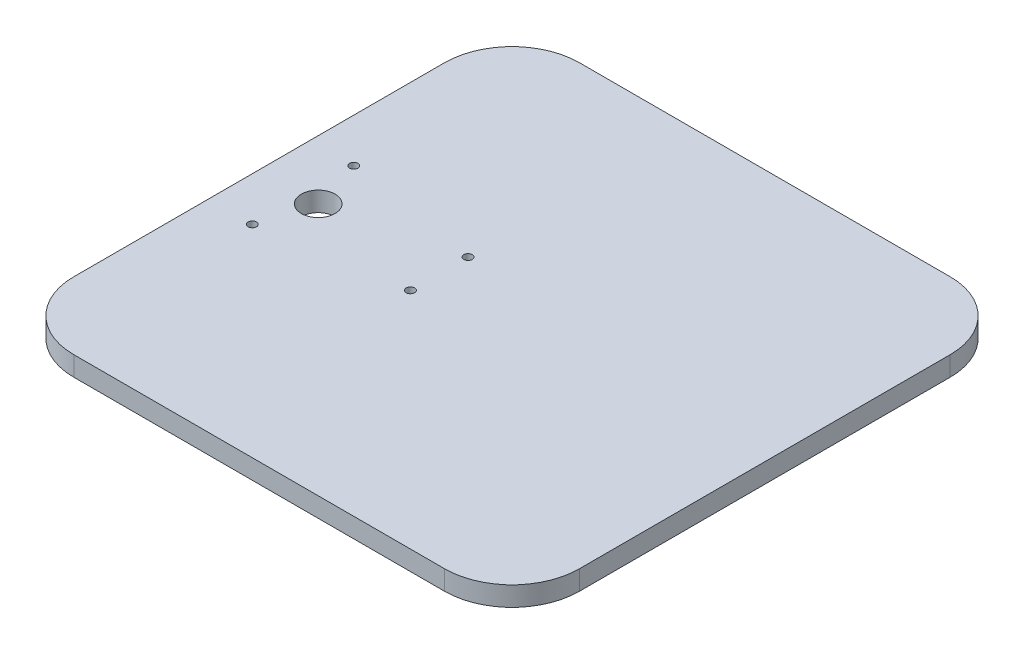
ISO-10303-21;
HEADER;
FILE_DESCRIPTION(('STEP AP214'),'2;1');
FILE_NAME('part.step','',(''),(''),'','','');
FILE_SCHEMA(('AUTOMOTIVE_DESIGN { 1 0 10303 214 1 1 1 1 }'));
ENDSEC;
DATA;
#1=APPLICATION_CONTEXT('core data for automotive mechanical design processes');
#2=APPLICATION_PROTOCOL_DEFINITION('international standard','automotive_design',2000,#1);
#3=PRODUCT_CONTEXT('',#1,'mechanical');
#4=PRODUCT('Part','Part','',(#3));
#5=PRODUCT_RELATED_PRODUCT_CATEGORY('part','',(#4));
#6=PRODUCT_DEFINITION_FORMATION('','',#4);
#7=PRODUCT_DEFINITION_CONTEXT('part definition',#1,'design');
#8=PRODUCT_DEFINITION('design','',#6,#7);
#9=PRODUCT_DEFINITION_SHAPE('','',#8);
#10=(LENGTH_UNIT() NAMED_UNIT(*) SI_UNIT(.MILLI.,.METRE.));
#11=(NAMED_UNIT(*) PLANE_ANGLE_UNIT() SI_UNIT($,.RADIAN.));
#12=(NAMED_UNIT(*) SI_UNIT($,.STERADIAN.) SOLID_ANGLE_UNIT());
#13=UNCERTAINTY_MEASURE_WITH_UNIT(LENGTH_MEASURE(1.E-05),#10,'distance_accuracy_value','');
#14=(GEOMETRIC_REPRESENTATION_CONTEXT(3) GLOBAL_UNCERTAINTY_ASSIGNED_CONTEXT((#13)) GLOBAL_UNIT_ASSIGNED_CONTEXT((#10,
#11,#12)) REPRESENTATION_CONTEXT('',''));
#15=CARTESIAN_POINT('',(0.,0.,0.));
#16=DIRECTION('',(0.,0.,1.));
#17=DIRECTION('',(1.,0.,0.));
#18=AXIS2_PLACEMENT_3D('',#15,#16,#17);
#19=CARTESIAN_POINT('',(-61.9857466338404,0.,-15.05));
#20=DIRECTION('',(0.,1.,0.));
#21=DIRECTION('',(0.,0.,1.));
#22=AXIS2_PLACEMENT_3D('',#19,#20,#21);
#23=CYLINDRICAL_SURFACE('',#22,1.25);
#24=CARTESIAN_POINT('',(-61.9857466338404,5.8,-15.05));
#25=DIRECTION('',(0.,1.,0.));
#26=DIRECTION('',(0.,0.,1.));
#27=AXIS2_PLACEMENT_3D('',#24,#25,#26);
#28=CIRCLE('',#27,1.25);
#29=CARTESIAN_POINT('',(-61.9857466338404,5.8,-13.8));
#30=VERTEX_POINT('',#29);
#31=EDGE_CURVE('E201',#30,#30,#28,.T.);
#32=ORIENTED_EDGE('',*,*,#31,.T.);
#33=EDGE_LOOP('',(#32));
#34=FACE_BOUND('',#33,.T.);
#35=CARTESIAN_POINT('',(-61.9857466338404,3.5,-15.05));
#36=DIRECTION('',(0.,-1.,0.));
#37=DIRECTION('',(0.,0.,-1.));
#38=AXIS2_PLACEMENT_3D('',#35,#36,#37);
#39=CIRCLE('',#38,1.25);
#40=CARTESIAN_POINT('',(-61.9857466338404,3.5,-16.3));
#41=VERTEX_POINT('',#40);
#42=EDGE_CURVE('E42',#41,#41,#39,.F.);
#43=ORIENTED_EDGE('',*,*,#42,.F.);
#44=EDGE_LOOP('',(#43));
#45=FACE_BOUND('',#44,.T.);
#46=ADVANCED_FACE('F38',(#34,#45),#23,.F.);
#47=CARTESIAN_POINT('',(-21.5857466338404,0.,8.55));
#48=DIRECTION('',(0.,1.,0.));
#49=DIRECTION('',(0.,0.,1.));
#50=AXIS2_PLACEMENT_3D('',#47,#48,#49);
#51=CYLINDRICAL_SURFACE('',#50,1.25);
#52=CARTESIAN_POINT('',(-21.5857466338404,5.8,8.55));
#53=DIRECTION('',(0.,1.,0.));
#54=DIRECTION('',(0.,0.,1.));
#55=AXIS2_PLACEMENT_3D('',#52,#53,#54);
#56=CIRCLE('',#55,1.25);
#57=CARTESIAN_POINT('',(-21.5857466338404,5.8,9.8));
#58=VERTEX_POINT('',#57);
#59=EDGE_CURVE('E207',#58,#58,#56,.T.);
#60=ORIENTED_EDGE('',*,*,#59,.T.);
#61=EDGE_LOOP('',(#60));
#62=FACE_BOUND('',#61,.T.);
#63=CARTESIAN_POINT('',(-21.5857466338404,3.5,8.55));
#64=DIRECTION('',(0.,-1.,0.));
#65=DIRECTION('',(0.,0.,-1.));
#66=AXIS2_PLACEMENT_3D('',#63,#64,#65);
#67=CIRCLE('',#66,1.25);
#68=CARTESIAN_POINT('',(-21.5857466338404,3.5,7.3));
#69=VERTEX_POINT('',#68);
#70=EDGE_CURVE('E189',#69,#69,#67,.F.);
#71=ORIENTED_EDGE('',*,*,#70,.F.);
#72=EDGE_LOOP('',(#71));
#73=FACE_BOUND('',#72,.T.);
#74=ADVANCED_FACE('F261',(#62,#73),#51,.F.);
#75=CARTESIAN_POINT('',(-21.5857466338404,0.,-8.55));
#76=DIRECTION('',(0.,1.,0.));
#77=DIRECTION('',(0.,0.,1.));
#78=AXIS2_PLACEMENT_3D('',#75,#76,#77);
#79=CYLINDRICAL_SURFACE('',#78,1.25);
#80=CARTESIAN_POINT('',(-21.5857466338404,5.8,-8.55));
#81=DIRECTION('',(0.,1.,0.));
#82=DIRECTION('',(0.,0.,1.));
#83=AXIS2_PLACEMENT_3D('',#80,#81,#82);
#84=CIRCLE('',#83,1.25);
#85=CARTESIAN_POINT('',(-21.5857466338404,5.8,-7.3));
#86=VERTEX_POINT('',#85);
#87=EDGE_CURVE('E216',#86,#86,#84,.T.);
#88=ORIENTED_EDGE('',*,*,#87,.T.);
#89=EDGE_LOOP('',(#88));
#90=FACE_BOUND('',#89,.T.);
#91=CARTESIAN_POINT('',(-21.5857466338404,3.5,-8.55));
#92=DIRECTION('',(0.,-1.,0.));
#93=DIRECTION('',(0.,0.,-1.));
#94=AXIS2_PLACEMENT_3D('',#91,#92,#93);
#95=CIRCLE('',#94,1.25);
#96=CARTESIAN_POINT('',(-21.5857466338404,3.5,-9.8));
#97=VERTEX_POINT('',#96);
#98=EDGE_CURVE('E185',#97,#97,#95,.F.);
#99=ORIENTED_EDGE('',*,*,#98,.F.);
#100=EDGE_LOOP('',(#99));
#101=FACE_BOUND('',#100,.T.);
#102=ADVANCED_FACE('F267',(#90,#101),#79,.F.);
#103=CARTESIAN_POINT('',(-61.9857466338404,0.,15.05));
#104=DIRECTION('',(0.,1.,0.));
#105=DIRECTION('',(0.,0.,1.));
#106=AXIS2_PLACEMENT_3D('',#103,#104,#105);
#107=CYLINDRICAL_SURFACE('',#106,1.25);
#108=CARTESIAN_POINT('',(-61.9857466338404,5.8,15.05));
#109=DIRECTION('',(0.,1.,0.));
#110=DIRECTION('',(0.,0.,1.));
#111=AXIS2_PLACEMENT_3D('',#108,#109,#110);
#112=CIRCLE('',#111,1.25);
#113=CARTESIAN_POINT('',(-61.9857466338404,5.8,16.3));
#114=VERTEX_POINT('',#113);
#115=EDGE_CURVE('E224',#114,#114,#112,.T.);
#116=ORIENTED_EDGE('',*,*,#115,.T.);
#117=EDGE_LOOP('',(#116));
#118=FACE_BOUND('',#117,.T.);
#119=CARTESIAN_POINT('',(-61.9857466338404,3.5,15.05));
#120=DIRECTION('',(0.,-1.,0.));
#121=DIRECTION('',(0.,0.,-1.));
#122=AXIS2_PLACEMENT_3D('',#119,#120,#121);
#123=CIRCLE('',#122,1.25);
#124=CARTESIAN_POINT('',(-61.9857466338404,3.5,13.8));
#125=VERTEX_POINT('',#124);
#126=EDGE_CURVE('E181',#125,#125,#123,.F.);
#127=ORIENTED_EDGE('',*,*,#126,.F.);
#128=EDGE_LOOP('',(#127));
#129=FACE_BOUND('',#128,.T.);
#130=ADVANCED_FACE('F359',(#118,#129),#107,.F.);
#131=CARTESIAN_POINT('',(-75.,5.8,75.));
#132=DIRECTION('',(1.,0.,0.));
#133=DIRECTION('',(0.,0.,-1.));
#134=AXIS2_PLACEMENT_3D('',#131,#132,#133);
#135=PLANE('',#134);
#136=DIRECTION('',(0.,0.,1.));
#137=VECTOR('',#136,1.);
#138=CARTESIAN_POINT('',(-75.,0.,75.));
#139=LINE('',#138,#137);
#140=CARTESIAN_POINT('',(-75.,0.,-55.));
#141=VERTEX_POINT('',#140);
#142=CARTESIAN_POINT('',(-75.,0.,55.));
#143=VERTEX_POINT('',#142);
#144=EDGE_CURVE('E227',#141,#143,#139,.T.);
#145=ORIENTED_EDGE('',*,*,#144,.T.);
#146=DIRECTION('',(0.,-1.,0.));
#147=VECTOR('',#146,1.);
#148=CARTESIAN_POINT('',(-75.,5.8,55.));
#149=LINE('',#148,#147);
#150=CARTESIAN_POINT('',(-75.,5.8,55.));
#151=VERTEX_POINT('',#150);
#152=EDGE_CURVE('E11',#143,#151,#149,.F.);
#153=ORIENTED_EDGE('',*,*,#152,.T.);
#154=DIRECTION('',(0.,0.,1.));
#155=VECTOR('',#154,1.);
#156=CARTESIAN_POINT('',(-75.,5.8,75.));
#157=LINE('',#156,#155);
#158=CARTESIAN_POINT('',(-75.,5.8,-55.));
#159=VERTEX_POINT('',#158);
#160=EDGE_CURVE('E136',#159,#151,#157,.T.);
#161=ORIENTED_EDGE('',*,*,#160,.F.);
#162=DIRECTION('',(0.,-1.,0.));
#163=VECTOR('',#162,1.);
#164=CARTESIAN_POINT('',(-75.,5.8,-55.));
#165=LINE('',#164,#163);
#166=EDGE_CURVE('E48',#159,#141,#165,.T.);
#167=ORIENTED_EDGE('',*,*,#166,.T.);
#168=EDGE_LOOP('',(#145,#153,#161,#167));
#169=FACE_BOUND('',#168,.T.);
#170=ADVANCED_FACE('F258',(#169),#135,.F.);
#171=CARTESIAN_POINT('',(75.,5.8,75.));
#172=DIRECTION('',(0.,0.,-1.));
#173=DIRECTION('',(-1.,0.,0.));
#174=AXIS2_PLACEMENT_3D('',#171,#172,#173);
#175=PLANE('',#174);
#176=DIRECTION('',(1.,0.,0.));
#177=VECTOR('',#176,1.);
#178=CARTESIAN_POINT('',(75.,0.,75.));
#179=LINE('',#178,#177);
#180=CARTESIAN_POINT('',(-55.,0.,75.));
#181=VERTEX_POINT('',#180);
#182=CARTESIAN_POINT('',(55.,0.,75.));
#183=VERTEX_POINT('',#182);
#184=EDGE_CURVE('E143',#181,#183,#179,.T.);
#185=ORIENTED_EDGE('',*,*,#184,.T.);
#186=DIRECTION('',(0.,-1.,0.));
#187=VECTOR('',#186,1.);
#188=CARTESIAN_POINT('',(55.,5.8,75.));
#189=LINE('',#188,#187);
#190=CARTESIAN_POINT('',(55.,5.8,75.));
#191=VERTEX_POINT('',#190);
#192=EDGE_CURVE('E56',#183,#191,#189,.F.);
#193=ORIENTED_EDGE('',*,*,#192,.T.);
#194=DIRECTION('',(1.,0.,0.));
#195=VECTOR('',#194,1.);
#196=CARTESIAN_POINT('',(75.,5.8,75.));
#197=LINE('',#196,#195);
#198=CARTESIAN_POINT('',(-55.,5.8,75.));
#199=VERTEX_POINT('',#198);
#200=EDGE_CURVE('E141',#199,#191,#197,.T.);
#201=ORIENTED_EDGE('',*,*,#200,.F.);
#202=DIRECTION('',(0.,-1.,0.));
#203=VECTOR('',#202,1.);
#204=CARTESIAN_POINT('',(-55.,5.8,75.));
#205=LINE('',#204,#203);
#206=EDGE_CURVE('E172',#199,#181,#205,.T.);
#207=ORIENTED_EDGE('',*,*,#206,.T.);
#208=EDGE_LOOP('',(#185,#193,#201,#207));
#209=FACE_BOUND('',#208,.T.);
#210=ADVANCED_FACE('F241',(#209),#175,.F.);
#211=CARTESIAN_POINT('',(75.,5.8,75.));
#212=DIRECTION('',(-1.,0.,0.));
#213=DIRECTION('',(0.,0.,1.));
#214=AXIS2_PLACEMENT_3D('',#211,#212,#213);
#215=PLANE('',#214);
#216=DIRECTION('',(0.,0.,-1.));
#217=VECTOR('',#216,1.);
#218=CARTESIAN_POINT('',(75.,0.,75.));
#219=LINE('',#218,#217);
#220=CARTESIAN_POINT('',(75.,0.,55.));
#221=VERTEX_POINT('',#220);
#222=CARTESIAN_POINT('',(75.,0.,-55.));
#223=VERTEX_POINT('',#222);
#224=EDGE_CURVE('E137',#221,#223,#219,.T.);
#225=ORIENTED_EDGE('',*,*,#224,.T.);
#226=DIRECTION('',(0.,-1.,0.));
#227=VECTOR('',#226,1.);
#228=CARTESIAN_POINT('',(75.,5.8,-55.));
#229=LINE('',#228,#227);
#230=CARTESIAN_POINT('',(75.,5.8,-55.));
#231=VERTEX_POINT('',#230);
#232=EDGE_CURVE('E112',#223,#231,#229,.F.);
#233=ORIENTED_EDGE('',*,*,#232,.T.);
#234=DIRECTION('',(0.,0.,-1.));
#235=VECTOR('',#234,1.);
#236=CARTESIAN_POINT('',(75.,5.8,75.));
#237=LINE('',#236,#235);
#238=CARTESIAN_POINT('',(75.,5.8,55.));
#239=VERTEX_POINT('',#238);
#240=EDGE_CURVE('E231',#239,#231,#237,.T.);
#241=ORIENTED_EDGE('',*,*,#240,.F.);
#242=DIRECTION('',(0.,-1.,0.));
#243=VECTOR('',#242,1.);
#244=CARTESIAN_POINT('',(75.,5.8,55.));
#245=LINE('',#244,#243);
#246=EDGE_CURVE('E118',#239,#221,#245,.T.);
#247=ORIENTED_EDGE('',*,*,#246,.T.);
#248=EDGE_LOOP('',(#225,#233,#241,#247));
#249=FACE_BOUND('',#248,.T.);
#250=ADVANCED_FACE('F250',(#249),#215,.F.);
#251=CARTESIAN_POINT('',(75.,5.8,-75.));
#252=DIRECTION('',(0.,0.,1.));
#253=DIRECTION('',(1.,0.,0.));
#254=AXIS2_PLACEMENT_3D('',#251,#252,#253);
#255=PLANE('',#254);
#256=DIRECTION('',(-1.,0.,0.));
#257=VECTOR('',#256,1.);
#258=CARTESIAN_POINT('',(75.,5.8,-75.));
#259=LINE('',#258,#257);
#260=CARTESIAN_POINT('',(55.,5.8,-75.));
#261=VERTEX_POINT('',#260);
#262=CARTESIAN_POINT('',(-55.,5.8,-75.));
#263=VERTEX_POINT('',#262);
#264=EDGE_CURVE('E128',#261,#263,#259,.T.);
#265=ORIENTED_EDGE('',*,*,#264,.F.);
#266=DIRECTION('',(0.,-1.,0.));
#267=VECTOR('',#266,1.);
#268=CARTESIAN_POINT('',(55.,5.8,-75.));
#269=LINE('',#268,#267);
#270=CARTESIAN_POINT('',(55.,0.,-75.));
#271=VERTEX_POINT('',#270);
#272=EDGE_CURVE('E111',#261,#271,#269,.T.);
#273=ORIENTED_EDGE('',*,*,#272,.T.);
#274=DIRECTION('',(-1.,0.,0.));
#275=VECTOR('',#274,1.);
#276=CARTESIAN_POINT('',(75.,0.,-75.));
#277=LINE('',#276,#275);
#278=CARTESIAN_POINT('',(-55.,0.,-75.));
#279=VERTEX_POINT('',#278);
#280=EDGE_CURVE('E125',#271,#279,#277,.T.);
#281=ORIENTED_EDGE('',*,*,#280,.T.);
#282=DIRECTION('',(0.,-1.,0.));
#283=VECTOR('',#282,1.);
#284=CARTESIAN_POINT('',(-55.,5.8,-75.));
#285=LINE('',#284,#283);
#286=EDGE_CURVE('E131',#279,#263,#285,.F.);
#287=ORIENTED_EDGE('',*,*,#286,.T.);
#288=EDGE_LOOP('',(#265,#273,#281,#287));
#289=FACE_BOUND('',#288,.T.);
#290=ADVANCED_FACE('F124',(#289),#255,.F.);
#291=CARTESIAN_POINT('',(0.,5.8,0.));
#292=DIRECTION('',(0.,1.,0.));
#293=DIRECTION('',(0.,0.,1.));
#294=AXIS2_PLACEMENT_3D('',#291,#292,#293);
#295=PLANE('',#294);
#296=ORIENTED_EDGE('',*,*,#115,.F.);
#297=EDGE_LOOP('',(#296));
#298=FACE_BOUND('',#297,.T.);
#299=CARTESIAN_POINT('',(-57.4857466338404,5.8,0.));
#300=DIRECTION('',(0.,1.,0.));
#301=DIRECTION('',(0.,0.,1.));
#302=AXIS2_PLACEMENT_3D('',#299,#300,#301);
#303=CIRCLE('',#302,5.);
#304=CARTESIAN_POINT('',(-57.4857466338404,5.8,5.));
#305=VERTEX_POINT('',#304);
#306=EDGE_CURVE('E220',#305,#305,#303,.T.);
#307=ORIENTED_EDGE('',*,*,#306,.F.);
#308=EDGE_LOOP('',(#307));
#309=FACE_BOUND('',#308,.T.);
#310=ORIENTED_EDGE('',*,*,#87,.F.);
#311=EDGE_LOOP('',(#310));
#312=FACE_BOUND('',#311,.T.);
#313=ORIENTED_EDGE('',*,*,#59,.F.);
#314=EDGE_LOOP('',(#313));
#315=FACE_BOUND('',#314,.T.);
#316=ORIENTED_EDGE('',*,*,#31,.F.);
#317=EDGE_LOOP('',(#316));
#318=FACE_BOUND('',#317,.T.);
#319=ORIENTED_EDGE('',*,*,#240,.T.);
#320=CARTESIAN_POINT('',(55.,5.8,-55.));
#321=DIRECTION('',(0.,1.,0.));
#322=DIRECTION('',(0.,0.,1.));
#323=AXIS2_PLACEMENT_3D('',#320,#321,#322);
#324=CIRCLE('',#323,20.);
#325=EDGE_CURVE('E169',#231,#261,#324,.T.);
#326=ORIENTED_EDGE('',*,*,#325,.T.);
#327=ORIENTED_EDGE('',*,*,#264,.T.);
#328=CARTESIAN_POINT('',(-55.,5.8,-55.));
#329=DIRECTION('',(0.,1.,0.));
#330=DIRECTION('',(0.,0.,1.));
#331=AXIS2_PLACEMENT_3D('',#328,#329,#330);
#332=CIRCLE('',#331,20.);
#333=EDGE_CURVE('E161',#263,#159,#332,.T.);
#334=ORIENTED_EDGE('',*,*,#333,.T.);
#335=ORIENTED_EDGE('',*,*,#160,.T.);
#336=CARTESIAN_POINT('',(-55.,5.8,55.));
#337=DIRECTION('',(0.,1.,0.));
#338=DIRECTION('',(0.,0.,1.));
#339=AXIS2_PLACEMENT_3D('',#336,#337,#338);
#340=CIRCLE('',#339,20.);
#341=EDGE_CURVE('E63',#151,#199,#340,.T.);
#342=ORIENTED_EDGE('',*,*,#341,.T.);
#343=ORIENTED_EDGE('',*,*,#200,.T.);
#344=CARTESIAN_POINT('',(55.,5.8,55.));
#345=DIRECTION('',(0.,1.,0.));
#346=DIRECTION('',(0.,0.,1.));
#347=AXIS2_PLACEMENT_3D('',#344,#345,#346);
#348=CIRCLE('',#347,20.);
#349=EDGE_CURVE('E166',#191,#239,#348,.T.);
#350=ORIENTED_EDGE('',*,*,#349,.T.);
#351=EDGE_LOOP('',(#319,#326,#327,#334,#335,#342,#343,#350));
#352=FACE_BOUND('',#351,.T.);
#353=ADVANCED_FACE('F248',(#298,#309,#312,#315,#318,#352),#295,.T.);
#354=CARTESIAN_POINT('',(0.,0.,0.));
#355=DIRECTION('',(0.,1.,0.));
#356=DIRECTION('',(0.,0.,1.));
#357=AXIS2_PLACEMENT_3D('',#354,#355,#356);
#358=PLANE('',#357);
#359=CARTESIAN_POINT('',(-21.5857466338404,0.,8.55));
#360=DIRECTION('',(0.,-1.,0.));
#361=DIRECTION('',(0.,0.,-1.));
#362=AXIS2_PLACEMENT_3D('',#359,#360,#361);
#363=CIRCLE('',#362,6.25);
#364=CARTESIAN_POINT('',(-21.5857466338404,0.,2.3));
#365=VERTEX_POINT('',#364);
#366=EDGE_CURVE('E287',#365,#365,#363,.T.);
#367=ORIENTED_EDGE('',*,*,#366,.F.);
#368=EDGE_LOOP('',(#367));
#369=FACE_BOUND('',#368,.T.);
#370=CARTESIAN_POINT('',(-61.9857466338404,0.,-15.05));
#371=DIRECTION('',(0.,-1.,0.));
#372=DIRECTION('',(0.,0.,-1.));
#373=AXIS2_PLACEMENT_3D('',#370,#371,#372);
#374=CIRCLE('',#373,6.25);
#375=CARTESIAN_POINT('',(-61.9857466338404,0.,-21.3));
#376=VERTEX_POINT('',#375);
#377=EDGE_CURVE('E291',#376,#376,#374,.T.);
#378=ORIENTED_EDGE('',*,*,#377,.F.);
#379=EDGE_LOOP('',(#378));
#380=FACE_BOUND('',#379,.T.);
#381=CARTESIAN_POINT('',(-61.9857466338404,0.,15.05));
#382=DIRECTION('',(0.,-1.,0.));
#383=DIRECTION('',(0.,0.,-1.));
#384=AXIS2_PLACEMENT_3D('',#381,#382,#383);
#385=CIRCLE('',#384,6.25);
#386=CARTESIAN_POINT('',(-61.9857466338404,0.,8.80000000000001));
#387=VERTEX_POINT('',#386);
#388=EDGE_CURVE('E295',#387,#387,#385,.T.);
#389=ORIENTED_EDGE('',*,*,#388,.F.);
#390=EDGE_LOOP('',(#389));
#391=FACE_BOUND('',#390,.T.);
#392=CARTESIAN_POINT('',(-21.5857466338404,0.,-8.55));
#393=DIRECTION('',(0.,-1.,0.));
#394=DIRECTION('',(0.,0.,-1.));
#395=AXIS2_PLACEMENT_3D('',#392,#393,#394);
#396=CIRCLE('',#395,6.25);
#397=CARTESIAN_POINT('',(-21.5857466338404,0.,-14.8));
#398=VERTEX_POINT('',#397);
#399=EDGE_CURVE('E210',#398,#398,#396,.T.);
#400=ORIENTED_EDGE('',*,*,#399,.F.);
#401=EDGE_LOOP('',(#400));
#402=FACE_BOUND('',#401,.T.);
#403=CARTESIAN_POINT('',(-57.4857466338404,0.,0.));
#404=DIRECTION('',(0.,1.,0.));
#405=DIRECTION('',(0.,0.,1.));
#406=AXIS2_PLACEMENT_3D('',#403,#404,#405);
#407=CIRCLE('',#406,5.);
#408=CARTESIAN_POINT('',(-57.4857466338404,0.,5.));
#409=VERTEX_POINT('',#408);
#410=EDGE_CURVE('E196',#409,#409,#407,.T.);
#411=ORIENTED_EDGE('',*,*,#410,.T.);
#412=EDGE_LOOP('',(#411));
#413=FACE_BOUND('',#412,.T.);
#414=ORIENTED_EDGE('',*,*,#280,.F.);
#415=CARTESIAN_POINT('',(55.,0.,-55.));
#416=DIRECTION('',(0.,1.,0.));
#417=DIRECTION('',(0.,0.,1.));
#418=AXIS2_PLACEMENT_3D('',#415,#416,#417);
#419=CIRCLE('',#418,20.);
#420=EDGE_CURVE('E107',#271,#223,#419,.F.);
#421=ORIENTED_EDGE('',*,*,#420,.T.);
#422=ORIENTED_EDGE('',*,*,#224,.F.);
#423=CARTESIAN_POINT('',(55.,0.,55.));
#424=DIRECTION('',(0.,1.,0.));
#425=DIRECTION('',(0.,0.,1.));
#426=AXIS2_PLACEMENT_3D('',#423,#424,#425);
#427=CIRCLE('',#426,20.);
#428=EDGE_CURVE('E119',#221,#183,#427,.F.);
#429=ORIENTED_EDGE('',*,*,#428,.T.);
#430=ORIENTED_EDGE('',*,*,#184,.F.);
#431=CARTESIAN_POINT('',(-55.,0.,55.));
#432=DIRECTION('',(0.,1.,0.));
#433=DIRECTION('',(0.,0.,1.));
#434=AXIS2_PLACEMENT_3D('',#431,#432,#433);
#435=CIRCLE('',#434,20.);
#436=EDGE_CURVE('E151',#181,#143,#435,.F.);
#437=ORIENTED_EDGE('',*,*,#436,.T.);
#438=ORIENTED_EDGE('',*,*,#144,.F.);
#439=CARTESIAN_POINT('',(-55.,0.,-55.));
#440=DIRECTION('',(0.,1.,0.));
#441=DIRECTION('',(0.,0.,1.));
#442=AXIS2_PLACEMENT_3D('',#439,#440,#441);
#443=CIRCLE('',#442,20.);
#444=EDGE_CURVE('E130',#141,#279,#443,.F.);
#445=ORIENTED_EDGE('',*,*,#444,.T.);
#446=EDGE_LOOP('',(#414,#421,#422,#429,#430,#437,#438,#445));
#447=FACE_BOUND('',#446,.T.);
#448=ADVANCED_FACE('F133',(#369,#380,#391,#402,#413,#447),#358,.F.);
#449=CARTESIAN_POINT('',(-57.4857466338404,0.,0.));
#450=DIRECTION('',(0.,1.,0.));
#451=DIRECTION('',(0.,0.,1.));
#452=AXIS2_PLACEMENT_3D('',#449,#450,#451);
#453=CYLINDRICAL_SURFACE('',#452,5.);
#454=ORIENTED_EDGE('',*,*,#306,.T.);
#455=EDGE_LOOP('',(#454));
#456=FACE_BOUND('',#455,.T.);
#457=ORIENTED_EDGE('',*,*,#410,.F.);
#458=EDGE_LOOP('',(#457));
#459=FACE_BOUND('',#458,.T.);
#460=ADVANCED_FACE('F272',(#456,#459),#453,.F.);
#461=CARTESIAN_POINT('',(55.,5.8,-55.));
#462=DIRECTION('',(0.,-1.,0.));
#463=DIRECTION('',(0.,0.,-1.));
#464=AXIS2_PLACEMENT_3D('',#461,#462,#463);
#465=CYLINDRICAL_SURFACE('',#464,20.);
#466=ORIENTED_EDGE('',*,*,#325,.F.);
#467=ORIENTED_EDGE('',*,*,#232,.F.);
#468=ORIENTED_EDGE('',*,*,#420,.F.);
#469=ORIENTED_EDGE('',*,*,#272,.F.);
#470=EDGE_LOOP('',(#466,#467,#468,#469));
#471=FACE_BOUND('',#470,.T.);
#472=ADVANCED_FACE('F110',(#471),#465,.T.);
#473=CARTESIAN_POINT('',(55.,5.8,55.));
#474=DIRECTION('',(0.,-1.,0.));
#475=DIRECTION('',(0.,0.,-1.));
#476=AXIS2_PLACEMENT_3D('',#473,#474,#475);
#477=CYLINDRICAL_SURFACE('',#476,20.);
#478=ORIENTED_EDGE('',*,*,#349,.F.);
#479=ORIENTED_EDGE('',*,*,#192,.F.);
#480=ORIENTED_EDGE('',*,*,#428,.F.);
#481=ORIENTED_EDGE('',*,*,#246,.F.);
#482=EDGE_LOOP('',(#478,#479,#480,#481));
#483=FACE_BOUND('',#482,.T.);
#484=ADVANCED_FACE('F245',(#483),#477,.T.);
#485=CARTESIAN_POINT('',(-55.,5.8,55.));
#486=DIRECTION('',(0.,-1.,0.));
#487=DIRECTION('',(0.,0.,-1.));
#488=AXIS2_PLACEMENT_3D('',#485,#486,#487);
#489=CYLINDRICAL_SURFACE('',#488,20.);
#490=ORIENTED_EDGE('',*,*,#341,.F.);
#491=ORIENTED_EDGE('',*,*,#152,.F.);
#492=ORIENTED_EDGE('',*,*,#436,.F.);
#493=ORIENTED_EDGE('',*,*,#206,.F.);
#494=EDGE_LOOP('',(#490,#491,#492,#493));
#495=FACE_BOUND('',#494,.T.);
#496=ADVANCED_FACE('F429',(#495),#489,.T.);
#497=CARTESIAN_POINT('',(-55.,5.8,-55.));
#498=DIRECTION('',(0.,-1.,0.));
#499=DIRECTION('',(0.,0.,-1.));
#500=AXIS2_PLACEMENT_3D('',#497,#498,#499);
#501=CYLINDRICAL_SURFACE('',#500,20.);
#502=ORIENTED_EDGE('',*,*,#333,.F.);
#503=ORIENTED_EDGE('',*,*,#286,.F.);
#504=ORIENTED_EDGE('',*,*,#444,.F.);
#505=ORIENTED_EDGE('',*,*,#166,.F.);
#506=EDGE_LOOP('',(#502,#503,#504,#505));
#507=FACE_BOUND('',#506,.T.);
#508=ADVANCED_FACE('F40',(#507),#501,.T.);
#509=CARTESIAN_POINT('',(-61.9857466338404,3.5,15.05));
#510=DIRECTION('',(0.,-1.,0.));
#511=DIRECTION('',(0.,0.,-1.));
#512=AXIS2_PLACEMENT_3D('',#509,#510,#511);
#513=PLANE('',#512);
#514=CARTESIAN_POINT('',(-61.9857466338404,3.5,15.05));
#515=DIRECTION('',(0.,-1.,0.));
#516=DIRECTION('',(0.,0.,-1.));
#517=AXIS2_PLACEMENT_3D('',#514,#515,#516);
#518=CIRCLE('',#517,6.25);
#519=CARTESIAN_POINT('',(-61.9857466338404,3.5,8.80000000000001));
#520=VERTEX_POINT('',#519);
#521=EDGE_CURVE('E318',#520,#520,#518,.T.);
#522=ORIENTED_EDGE('',*,*,#521,.T.);
#523=EDGE_LOOP('',(#522));
#524=FACE_BOUND('',#523,.T.);
#525=ORIENTED_EDGE('',*,*,#126,.T.);
#526=EDGE_LOOP('',(#525));
#527=FACE_BOUND('',#526,.T.);
#528=ADVANCED_FACE('F329',(#524,#527),#513,.T.);
#529=CARTESIAN_POINT('',(-61.9857466338404,3.5,15.05));
#530=DIRECTION('',(0.,-1.,0.));
#531=DIRECTION('',(0.,0.,-1.));
#532=AXIS2_PLACEMENT_3D('',#529,#530,#531);
#533=CYLINDRICAL_SURFACE('',#532,6.25);
#534=ORIENTED_EDGE('',*,*,#521,.F.);
#535=EDGE_LOOP('',(#534));
#536=FACE_BOUND('',#535,.T.);
#537=ORIENTED_EDGE('',*,*,#388,.T.);
#538=EDGE_LOOP('',(#537));
#539=FACE_BOUND('',#538,.T.);
#540=ADVANCED_FACE('F326',(#536,#539),#533,.F.);
#541=CARTESIAN_POINT('',(-21.5857466338404,3.5,-8.55));
#542=DIRECTION('',(0.,-1.,0.));
#543=DIRECTION('',(0.,0.,-1.));
#544=AXIS2_PLACEMENT_3D('',#541,#542,#543);
#545=PLANE('',#544);
#546=CARTESIAN_POINT('',(-21.5857466338404,3.5,-8.55));
#547=DIRECTION('',(0.,-1.,0.));
#548=DIRECTION('',(0.,0.,-1.));
#549=AXIS2_PLACEMENT_3D('',#546,#547,#548);
#550=CIRCLE('',#549,6.25);
#551=CARTESIAN_POINT('',(-21.5857466338404,3.5,-14.8));
#552=VERTEX_POINT('',#551);
#553=EDGE_CURVE('E186',#552,#552,#550,.T.);
#554=ORIENTED_EDGE('',*,*,#553,.T.);
#555=EDGE_LOOP('',(#554));
#556=FACE_BOUND('',#555,.T.);
#557=ORIENTED_EDGE('',*,*,#98,.T.);
#558=EDGE_LOOP('',(#557));
#559=FACE_BOUND('',#558,.T.);
#560=ADVANCED_FACE('F328',(#556,#559),#545,.T.);
#561=CARTESIAN_POINT('',(-21.5857466338404,3.5,-8.55));
#562=DIRECTION('',(0.,-1.,0.));
#563=DIRECTION('',(0.,0.,-1.));
#564=AXIS2_PLACEMENT_3D('',#561,#562,#563);
#565=CYLINDRICAL_SURFACE('',#564,6.25);
#566=ORIENTED_EDGE('',*,*,#553,.F.);
#567=EDGE_LOOP('',(#566));
#568=FACE_BOUND('',#567,.T.);
#569=ORIENTED_EDGE('',*,*,#399,.T.);
#570=EDGE_LOOP('',(#569));
#571=FACE_BOUND('',#570,.T.);
#572=ADVANCED_FACE('F336',(#568,#571),#565,.F.);
#573=CARTESIAN_POINT('',(-21.5857466338404,3.5,8.55));
#574=DIRECTION('',(0.,-1.,0.));
#575=DIRECTION('',(0.,0.,-1.));
#576=AXIS2_PLACEMENT_3D('',#573,#574,#575);
#577=PLANE('',#576);
#578=CARTESIAN_POINT('',(-21.5857466338404,3.5,8.55));
#579=DIRECTION('',(0.,-1.,0.));
#580=DIRECTION('',(0.,0.,-1.));
#581=AXIS2_PLACEMENT_3D('',#578,#579,#580);
#582=CIRCLE('',#581,6.25);
#583=CARTESIAN_POINT('',(-21.5857466338404,3.5,2.3));
#584=VERTEX_POINT('',#583);
#585=EDGE_CURVE('E300',#584,#584,#582,.T.);
#586=ORIENTED_EDGE('',*,*,#585,.T.);
#587=EDGE_LOOP('',(#586));
#588=FACE_BOUND('',#587,.T.);
#589=ORIENTED_EDGE('',*,*,#70,.T.);
#590=EDGE_LOOP('',(#589));
#591=FACE_BOUND('',#590,.T.);
#592=ADVANCED_FACE('F341',(#588,#591),#577,.T.);
#593=CARTESIAN_POINT('',(-21.5857466338404,3.5,8.55));
#594=DIRECTION('',(0.,-1.,0.));
#595=DIRECTION('',(0.,0.,-1.));
#596=AXIS2_PLACEMENT_3D('',#593,#594,#595);
#597=CYLINDRICAL_SURFACE('',#596,6.25);
#598=ORIENTED_EDGE('',*,*,#585,.F.);
#599=EDGE_LOOP('',(#598));
#600=FACE_BOUND('',#599,.T.);
#601=ORIENTED_EDGE('',*,*,#366,.T.);
#602=EDGE_LOOP('',(#601));
#603=FACE_BOUND('',#602,.T.);
#604=ADVANCED_FACE('F344',(#600,#603),#597,.F.);
#605=CARTESIAN_POINT('',(-61.9857466338404,3.5,-15.05));
#606=DIRECTION('',(0.,-1.,0.));
#607=DIRECTION('',(0.,0.,-1.));
#608=AXIS2_PLACEMENT_3D('',#605,#606,#607);
#609=PLANE('',#608);
#610=CARTESIAN_POINT('',(-61.9857466338404,3.5,-15.05));
#611=DIRECTION('',(0.,-1.,0.));
#612=DIRECTION('',(0.,0.,-1.));
#613=AXIS2_PLACEMENT_3D('',#610,#611,#612);
#614=CIRCLE('',#613,6.25);
#615=CARTESIAN_POINT('',(-61.9857466338404,3.5,-21.3));
#616=VERTEX_POINT('',#615);
#617=EDGE_CURVE('E309',#616,#616,#614,.T.);
#618=ORIENTED_EDGE('',*,*,#617,.T.);
#619=EDGE_LOOP('',(#618));
#620=FACE_BOUND('',#619,.T.);
#621=ORIENTED_EDGE('',*,*,#42,.T.);
#622=EDGE_LOOP('',(#621));
#623=FACE_BOUND('',#622,.T.);
#624=ADVANCED_FACE('F347',(#620,#623),#609,.T.);
#625=CARTESIAN_POINT('',(-61.9857466338404,3.5,-15.05));
#626=DIRECTION('',(0.,-1.,0.));
#627=DIRECTION('',(0.,0.,-1.));
#628=AXIS2_PLACEMENT_3D('',#625,#626,#627);
#629=CYLINDRICAL_SURFACE('',#628,6.25);
#630=ORIENTED_EDGE('',*,*,#617,.F.);
#631=EDGE_LOOP('',(#630));
#632=FACE_BOUND('',#631,.T.);
#633=ORIENTED_EDGE('',*,*,#377,.T.);
#634=EDGE_LOOP('',(#633));
#635=FACE_BOUND('',#634,.T.);
#636=ADVANCED_FACE('F351',(#632,#635),#629,.F.);
#637=CLOSED_SHELL('',(#46,#74,#102,#130,#170,#210,#250,#290,#353,#448,#460,#472,#484,#496,#508,
#528,#540,#560,#572,#592,#604,#624,#636));
#638=MANIFOLD_SOLID_BREP('B2',#637);
#639=ADVANCED_BREP_SHAPE_REPRESENTATION('',(#18,#638),#14);
#640=SHAPE_DEFINITION_REPRESENTATION(#9,#639);
ENDSEC;
END-ISO-10303-21;
